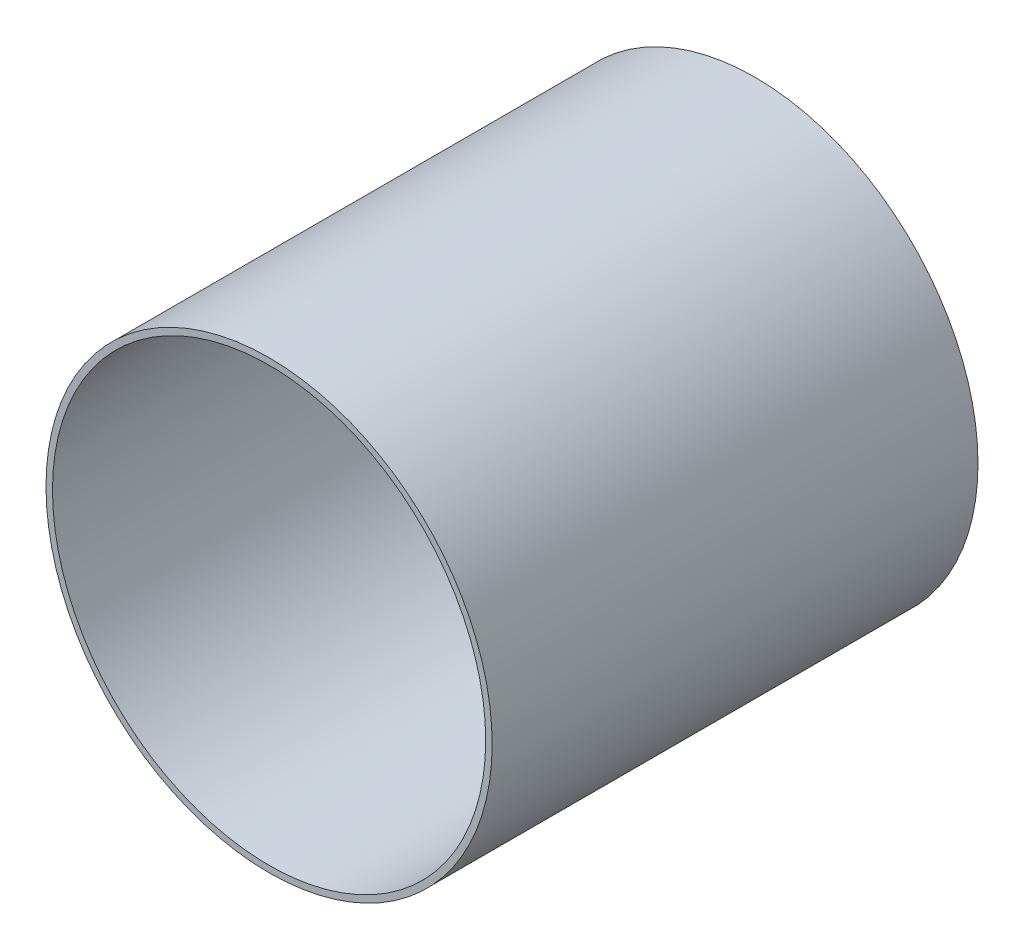
ISO-10303-21;
HEADER;
FILE_DESCRIPTION(('STEP AP214'),'2;1');
FILE_NAME('part.step','',(''),(''),'','','');
FILE_SCHEMA(('AUTOMOTIVE_DESIGN { 1 0 10303 214 1 1 1 1 }'));
ENDSEC;
DATA;
#1=APPLICATION_CONTEXT('core data for automotive mechanical design processes');
#2=APPLICATION_PROTOCOL_DEFINITION('international standard','automotive_design',2000,#1);
#3=PRODUCT_CONTEXT('',#1,'mechanical');
#4=PRODUCT('Part','Part','',(#3));
#5=PRODUCT_RELATED_PRODUCT_CATEGORY('part','',(#4));
#6=PRODUCT_DEFINITION_FORMATION('','',#4);
#7=PRODUCT_DEFINITION_CONTEXT('part definition',#1,'design');
#8=PRODUCT_DEFINITION('design','',#6,#7);
#9=PRODUCT_DEFINITION_SHAPE('','',#8);
#10=(LENGTH_UNIT() NAMED_UNIT(*) SI_UNIT(.MILLI.,.METRE.));
#11=(NAMED_UNIT(*) PLANE_ANGLE_UNIT() SI_UNIT($,.RADIAN.));
#12=(NAMED_UNIT(*) SI_UNIT($,.STERADIAN.) SOLID_ANGLE_UNIT());
#13=UNCERTAINTY_MEASURE_WITH_UNIT(LENGTH_MEASURE(1.E-05),#10,'distance_accuracy_value','');
#14=(GEOMETRIC_REPRESENTATION_CONTEXT(3) GLOBAL_UNCERTAINTY_ASSIGNED_CONTEXT((#13)) GLOBAL_UNIT_ASSIGNED_CONTEXT((#10,
#11,#12)) REPRESENTATION_CONTEXT('',''));
#15=CARTESIAN_POINT('',(0.,0.,0.));
#16=DIRECTION('',(0.,0.,1.));
#17=DIRECTION('',(1.,0.,0.));
#18=AXIS2_PLACEMENT_3D('',#15,#16,#17);
#19=CARTESIAN_POINT('',(0.,0.,60.));
#20=DIRECTION('',(0.,0.,1.));
#21=DIRECTION('',(1.,0.,0.));
#22=AXIS2_PLACEMENT_3D('',#19,#20,#21);
#23=PLANE('',#22);
#24=CARTESIAN_POINT('',(0.,0.,60.));
#25=DIRECTION('',(0.,0.,1.));
#26=DIRECTION('',(1.,0.,0.));
#27=AXIS2_PLACEMENT_3D('',#24,#25,#26);
#28=CIRCLE('',#27,27.55);
#29=CARTESIAN_POINT('',(27.55,0.,60.));
#30=VERTEX_POINT('',#29);
#31=EDGE_CURVE('E10',#30,#30,#28,.T.);
#32=ORIENTED_EDGE('',*,*,#31,.T.);
#33=EDGE_LOOP('',(#32));
#34=FACE_BOUND('',#33,.T.);
#35=CARTESIAN_POINT('',(0.,0.,60.));
#36=DIRECTION('',(0.,0.,1.));
#37=DIRECTION('',(1.,0.,0.));
#38=AXIS2_PLACEMENT_3D('',#35,#36,#37);
#39=CIRCLE('',#38,26.75);
#40=CARTESIAN_POINT('',(26.75,0.,60.));
#41=VERTEX_POINT('',#40);
#42=EDGE_CURVE('E41',#41,#41,#39,.T.);
#43=ORIENTED_EDGE('',*,*,#42,.F.);
#44=EDGE_LOOP('',(#43));
#45=FACE_BOUND('',#44,.T.);
#46=ADVANCED_FACE('F30',(#34,#45),#23,.T.);
#47=CARTESIAN_POINT('',(0.,0.,0.));
#48=DIRECTION('',(0.,0.,1.));
#49=DIRECTION('',(1.,0.,0.));
#50=AXIS2_PLACEMENT_3D('',#47,#48,#49);
#51=PLANE('',#50);
#52=CARTESIAN_POINT('',(0.,0.,0.));
#53=DIRECTION('',(0.,0.,1.));
#54=DIRECTION('',(1.,0.,0.));
#55=AXIS2_PLACEMENT_3D('',#52,#53,#54);
#56=CIRCLE('',#55,27.55);
#57=CARTESIAN_POINT('',(27.55,0.,0.));
#58=VERTEX_POINT('',#57);
#59=EDGE_CURVE('E34',#58,#58,#56,.T.);
#60=ORIENTED_EDGE('',*,*,#59,.F.);
#61=EDGE_LOOP('',(#60));
#62=FACE_BOUND('',#61,.T.);
#63=CARTESIAN_POINT('',(0.,0.,0.));
#64=DIRECTION('',(0.,0.,1.));
#65=DIRECTION('',(1.,0.,0.));
#66=AXIS2_PLACEMENT_3D('',#63,#64,#65);
#67=CIRCLE('',#66,26.75);
#68=CARTESIAN_POINT('',(26.75,0.,0.));
#69=VERTEX_POINT('',#68);
#70=EDGE_CURVE('E43',#69,#69,#67,.T.);
#71=ORIENTED_EDGE('',*,*,#70,.T.);
#72=EDGE_LOOP('',(#71));
#73=FACE_BOUND('',#72,.T.);
#74=ADVANCED_FACE('F53',(#62,#73),#51,.F.);
#75=CARTESIAN_POINT('',(0.,0.,60.));
#76=DIRECTION('',(0.,0.,-1.));
#77=DIRECTION('',(-1.,0.,0.));
#78=AXIS2_PLACEMENT_3D('',#75,#76,#77);
#79=CYLINDRICAL_SURFACE('',#78,27.55);
#80=ORIENTED_EDGE('',*,*,#31,.F.);
#81=EDGE_LOOP('',(#80));
#82=FACE_BOUND('',#81,.T.);
#83=ORIENTED_EDGE('',*,*,#59,.T.);
#84=EDGE_LOOP('',(#83));
#85=FACE_BOUND('',#84,.T.);
#86=ADVANCED_FACE('F32',(#82,#85),#79,.T.);
#87=CARTESIAN_POINT('',(0.,0.,60.));
#88=DIRECTION('',(0.,0.,-1.));
#89=DIRECTION('',(-1.,0.,0.));
#90=AXIS2_PLACEMENT_3D('',#87,#88,#89);
#91=CYLINDRICAL_SURFACE('',#90,26.75);
#92=ORIENTED_EDGE('',*,*,#42,.T.);
#93=EDGE_LOOP('',(#92));
#94=FACE_BOUND('',#93,.T.);
#95=ORIENTED_EDGE('',*,*,#70,.F.);
#96=EDGE_LOOP('',(#95));
#97=FACE_BOUND('',#96,.T.);
#98=ADVANCED_FACE('F49',(#94,#97),#91,.F.);
#99=CLOSED_SHELL('',(#46,#74,#86,#98));
#100=MANIFOLD_SOLID_BREP('B2',#99);
#101=ADVANCED_BREP_SHAPE_REPRESENTATION('',(#18,#100),#14);
#102=SHAPE_DEFINITION_REPRESENTATION(#9,#101);
ENDSEC;
END-ISO-10303-21;
